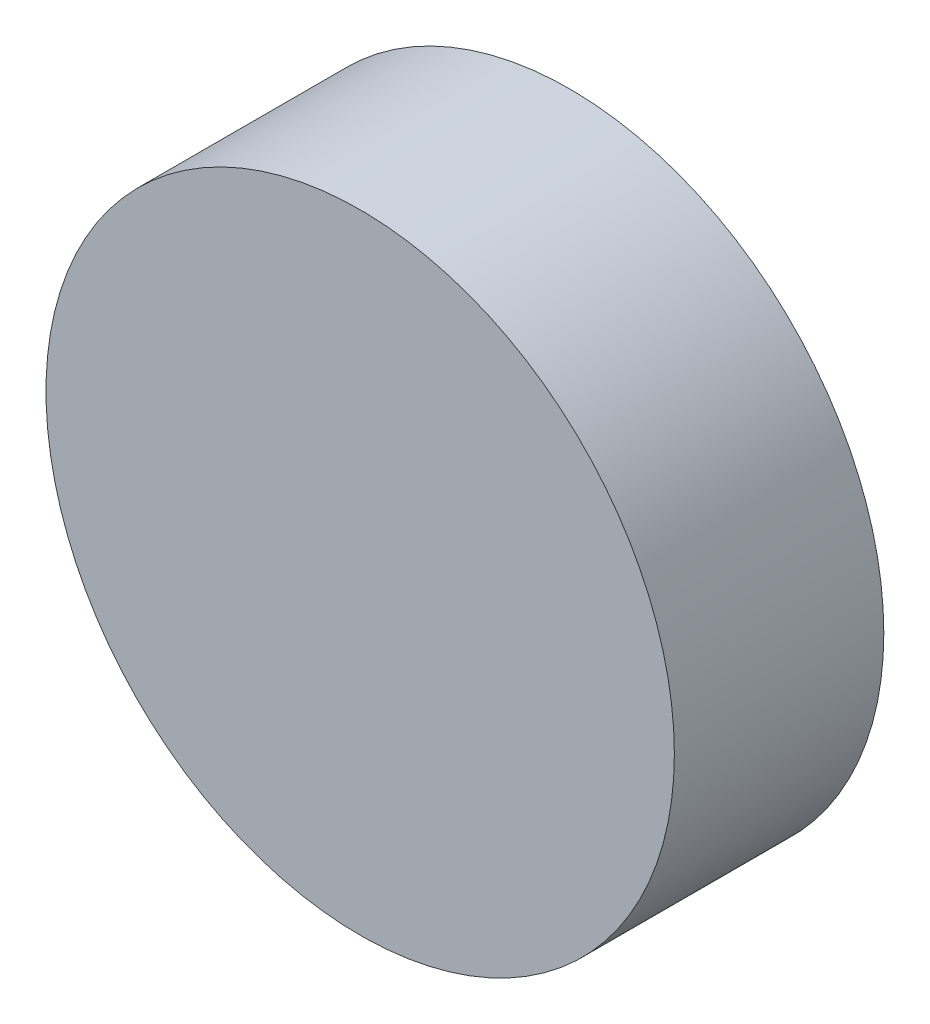
ISO-10303-21;
HEADER;
FILE_DESCRIPTION(('STEP AP214'),'2;1');
FILE_NAME('part.step','',(''),(''),'','','');
FILE_SCHEMA(('AUTOMOTIVE_DESIGN { 1 0 10303 214 1 1 1 1 }'));
ENDSEC;
DATA;
#1=APPLICATION_CONTEXT('core data for automotive mechanical design processes');
#2=APPLICATION_PROTOCOL_DEFINITION('international standard','automotive_design',2000,#1);
#3=PRODUCT_CONTEXT('',#1,'mechanical');
#4=PRODUCT('Part','Part','',(#3));
#5=PRODUCT_RELATED_PRODUCT_CATEGORY('part','',(#4));
#6=PRODUCT_DEFINITION_FORMATION('','',#4);
#7=PRODUCT_DEFINITION_CONTEXT('part definition',#1,'design');
#8=PRODUCT_DEFINITION('design','',#6,#7);
#9=PRODUCT_DEFINITION_SHAPE('','',#8);
#10=(LENGTH_UNIT() NAMED_UNIT(*) SI_UNIT(.MILLI.,.METRE.));
#11=(NAMED_UNIT(*) PLANE_ANGLE_UNIT() SI_UNIT($,.RADIAN.));
#12=(NAMED_UNIT(*) SI_UNIT($,.STERADIAN.) SOLID_ANGLE_UNIT());
#13=UNCERTAINTY_MEASURE_WITH_UNIT(LENGTH_MEASURE(1.E-05),#10,'distance_accuracy_value','');
#14=(GEOMETRIC_REPRESENTATION_CONTEXT(3) GLOBAL_UNCERTAINTY_ASSIGNED_CONTEXT((#13)) GLOBAL_UNIT_ASSIGNED_CONTEXT((#10,
#11,#12)) REPRESENTATION_CONTEXT('',''));
#15=CARTESIAN_POINT('',(0.,0.,0.));
#16=DIRECTION('',(0.,0.,1.));
#17=DIRECTION('',(1.,0.,0.));
#18=AXIS2_PLACEMENT_3D('',#15,#16,#17);
#19=CARTESIAN_POINT('',(0.,0.,2.));
#20=DIRECTION('',(0.,0.,-1.));
#21=DIRECTION('',(-1.,0.,0.));
#22=AXIS2_PLACEMENT_3D('',#19,#20,#21);
#23=CYLINDRICAL_SURFACE('',#22,3.);
#24=CARTESIAN_POINT('',(0.,0.,2.));
#25=DIRECTION('',(0.,0.,1.));
#26=DIRECTION('',(1.,0.,0.));
#27=AXIS2_PLACEMENT_3D('',#24,#25,#26);
#28=CIRCLE('',#27,3.);
#29=CARTESIAN_POINT('',(3.,0.,2.));
#30=VERTEX_POINT('',#29);
#31=EDGE_CURVE('E10',#30,#30,#28,.T.);
#32=ORIENTED_EDGE('',*,*,#31,.F.);
#33=EDGE_LOOP('',(#32));
#34=FACE_BOUND('',#33,.T.);
#35=CARTESIAN_POINT('',(0.,0.,0.));
#36=DIRECTION('',(0.,0.,1.));
#37=DIRECTION('',(1.,0.,0.));
#38=AXIS2_PLACEMENT_3D('',#35,#36,#37);
#39=CIRCLE('',#38,3.);
#40=CARTESIAN_POINT('',(3.,0.,0.));
#41=VERTEX_POINT('',#40);
#42=EDGE_CURVE('E46',#41,#41,#39,.T.);
#43=ORIENTED_EDGE('',*,*,#42,.T.);
#44=EDGE_LOOP('',(#43));
#45=FACE_BOUND('',#44,.T.);
#46=ADVANCED_FACE('F43',(#34,#45),#23,.T.);
#47=CARTESIAN_POINT('',(0.,0.,2.));
#48=DIRECTION('',(0.,0.,1.));
#49=DIRECTION('',(1.,0.,0.));
#50=AXIS2_PLACEMENT_3D('',#47,#48,#49);
#51=PLANE('',#50);
#52=ORIENTED_EDGE('',*,*,#31,.T.);
#53=EDGE_LOOP('',(#52));
#54=FACE_BOUND('',#53,.T.);
#55=ADVANCED_FACE('F60',(#54),#51,.T.);
#56=CARTESIAN_POINT('',(0.,0.,0.));
#57=DIRECTION('',(0.,0.,1.));
#58=DIRECTION('',(1.,0.,0.));
#59=AXIS2_PLACEMENT_3D('',#56,#57,#58);
#60=PLANE('',#59);
#61=ORIENTED_EDGE('',*,*,#42,.F.);
#62=EDGE_LOOP('',(#61));
#63=FACE_BOUND('',#62,.T.);
#64=ADVANCED_FACE('F58',(#63),#60,.F.);
#65=CLOSED_SHELL('',(#46,#55,#64));
#66=MANIFOLD_SOLID_BREP('B2',#65);
#67=ADVANCED_BREP_SHAPE_REPRESENTATION('',(#18,#66),#14);
#68=SHAPE_DEFINITION_REPRESENTATION(#9,#67);
ENDSEC;
END-ISO-10303-21;
